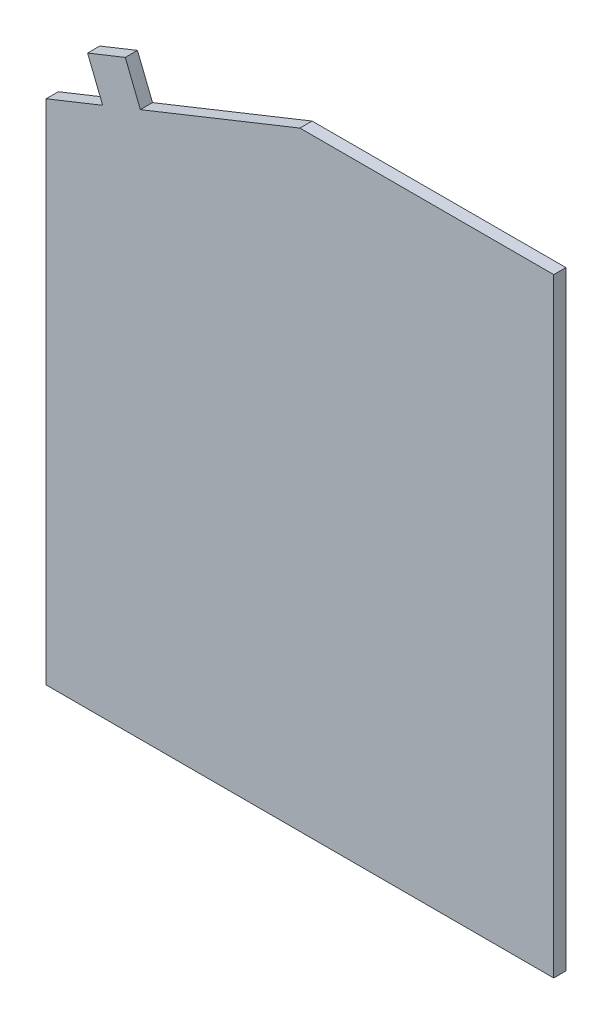
ISO-10303-21;
HEADER;
FILE_DESCRIPTION(('STEP AP214'),'2;1');
FILE_NAME('part.step','',(''),(''),'','','');
FILE_SCHEMA(('AUTOMOTIVE_DESIGN { 1 0 10303 214 1 1 1 1 }'));
ENDSEC;
DATA;
#1=APPLICATION_CONTEXT('core data for automotive mechanical design processes');
#2=APPLICATION_PROTOCOL_DEFINITION('international standard','automotive_design',2000,#1);
#3=PRODUCT_CONTEXT('',#1,'mechanical');
#4=PRODUCT('Part','Part','',(#3));
#5=PRODUCT_RELATED_PRODUCT_CATEGORY('part','',(#4));
#6=PRODUCT_DEFINITION_FORMATION('','',#4);
#7=PRODUCT_DEFINITION_CONTEXT('part definition',#1,'design');
#8=PRODUCT_DEFINITION('design','',#6,#7);
#9=PRODUCT_DEFINITION_SHAPE('','',#8);
#10=(LENGTH_UNIT() NAMED_UNIT(*) SI_UNIT(.MILLI.,.METRE.));
#11=(NAMED_UNIT(*) PLANE_ANGLE_UNIT() SI_UNIT($,.RADIAN.));
#12=(NAMED_UNIT(*) SI_UNIT($,.STERADIAN.) SOLID_ANGLE_UNIT());
#13=UNCERTAINTY_MEASURE_WITH_UNIT(LENGTH_MEASURE(1.E-05),#10,'distance_accuracy_value','');
#14=(GEOMETRIC_REPRESENTATION_CONTEXT(3) GLOBAL_UNCERTAINTY_ASSIGNED_CONTEXT((#13)) GLOBAL_UNIT_ASSIGNED_CONTEXT((#10,
#11,#12)) REPRESENTATION_CONTEXT('',''));
#15=CARTESIAN_POINT('',(0.,0.,0.));
#16=DIRECTION('',(0.,0.,1.));
#17=DIRECTION('',(1.,0.,0.));
#18=AXIS2_PLACEMENT_3D('',#15,#16,#17);
#19=CARTESIAN_POINT('',(0.,0.,3.));
#20=DIRECTION('',(1.,0.,0.));
#21=DIRECTION('',(0.,0.,-1.));
#22=AXIS2_PLACEMENT_3D('',#19,#20,#21);
#23=PLANE('',#22);
#24=DIRECTION('',(0.,-1.,0.));
#25=VECTOR('',#24,1.);
#26=CARTESIAN_POINT('',(0.,0.,0.));
#27=LINE('',#26,#25);
#28=CARTESIAN_POINT('',(0.,125.,0.));
#29=VERTEX_POINT('',#28);
#30=CARTESIAN_POINT('',(0.,0.,0.));
#31=VERTEX_POINT('',#30);
#32=EDGE_CURVE('E139',#29,#31,#27,.T.);
#33=ORIENTED_EDGE('',*,*,#32,.T.);
#34=DIRECTION('',(0.,0.,-1.));
#35=VECTOR('',#34,1.);
#36=CARTESIAN_POINT('',(0.,0.,3.));
#37=LINE('',#36,#35);
#38=CARTESIAN_POINT('',(0.,0.,3.));
#39=VERTEX_POINT('',#38);
#40=EDGE_CURVE('E11',#39,#31,#37,.T.);
#41=ORIENTED_EDGE('',*,*,#40,.F.);
#42=DIRECTION('',(0.,-1.,0.));
#43=VECTOR('',#42,1.);
#44=CARTESIAN_POINT('',(0.,0.,3.));
#45=LINE('',#44,#43);
#46=CARTESIAN_POINT('',(0.,125.,3.));
#47=VERTEX_POINT('',#46);
#48=EDGE_CURVE('E155',#47,#39,#45,.T.);
#49=ORIENTED_EDGE('',*,*,#48,.F.);
#50=DIRECTION('',(0.,0.,-1.));
#51=VECTOR('',#50,1.);
#52=CARTESIAN_POINT('',(0.,125.,3.));
#53=LINE('',#52,#51);
#54=EDGE_CURVE('E135',#47,#29,#53,.T.);
#55=ORIENTED_EDGE('',*,*,#54,.T.);
#56=EDGE_LOOP('',(#33,#41,#49,#55));
#57=FACE_BOUND('',#56,.T.);
#58=ADVANCED_FACE('F37',(#57),#23,.F.);
#59=CARTESIAN_POINT('',(0.,0.,3.));
#60=DIRECTION('',(0.,1.,0.));
#61=DIRECTION('',(0.,0.,1.));
#62=AXIS2_PLACEMENT_3D('',#59,#60,#61);
#63=PLANE('',#62);
#64=DIRECTION('',(1.,0.,0.));
#65=VECTOR('',#64,1.);
#66=CARTESIAN_POINT('',(0.,0.,0.));
#67=LINE('',#66,#65);
#68=CARTESIAN_POINT('',(125.,0.,0.));
#69=VERTEX_POINT('',#68);
#70=EDGE_CURVE('E142',#31,#69,#67,.T.);
#71=ORIENTED_EDGE('',*,*,#70,.T.);
#72=DIRECTION('',(0.,0.,-1.));
#73=VECTOR('',#72,1.);
#74=CARTESIAN_POINT('',(125.,0.,3.));
#75=LINE('',#74,#73);
#76=CARTESIAN_POINT('',(125.,0.,3.));
#77=VERTEX_POINT('',#76);
#78=EDGE_CURVE('E45',#77,#69,#75,.T.);
#79=ORIENTED_EDGE('',*,*,#78,.F.);
#80=DIRECTION('',(1.,0.,0.));
#81=VECTOR('',#80,1.);
#82=CARTESIAN_POINT('',(0.,0.,3.));
#83=LINE('',#82,#81);
#84=EDGE_CURVE('E99',#39,#77,#83,.T.);
#85=ORIENTED_EDGE('',*,*,#84,.F.);
#86=ORIENTED_EDGE('',*,*,#40,.T.);
#87=EDGE_LOOP('',(#71,#79,#85,#86));
#88=FACE_BOUND('',#87,.T.);
#89=ADVANCED_FACE('F198',(#88),#63,.F.);
#90=CARTESIAN_POINT('',(125.,150.,3.));
#91=DIRECTION('',(-1.,0.,0.));
#92=DIRECTION('',(0.,-1.,0.));
#93=AXIS2_PLACEMENT_3D('',#90,#91,#92);
#94=PLANE('',#93);
#95=DIRECTION('',(0.,1.,0.));
#96=VECTOR('',#95,1.);
#97=CARTESIAN_POINT('',(125.,150.,0.));
#98=LINE('',#97,#96);
#99=CARTESIAN_POINT('',(125.,150.,0.));
#100=VERTEX_POINT('',#99);
#101=EDGE_CURVE('E144',#69,#100,#98,.T.);
#102=ORIENTED_EDGE('',*,*,#101,.T.);
#103=DIRECTION('',(0.,0.,-1.));
#104=VECTOR('',#103,1.);
#105=CARTESIAN_POINT('',(125.,150.,3.));
#106=LINE('',#105,#104);
#107=CARTESIAN_POINT('',(125.,150.,3.));
#108=VERTEX_POINT('',#107);
#109=EDGE_CURVE('E165',#108,#100,#106,.T.);
#110=ORIENTED_EDGE('',*,*,#109,.F.);
#111=DIRECTION('',(0.,1.,0.));
#112=VECTOR('',#111,1.);
#113=CARTESIAN_POINT('',(125.,150.,3.));
#114=LINE('',#113,#112);
#115=EDGE_CURVE('E173',#77,#108,#114,.T.);
#116=ORIENTED_EDGE('',*,*,#115,.F.);
#117=ORIENTED_EDGE('',*,*,#78,.T.);
#118=EDGE_LOOP('',(#102,#110,#116,#117));
#119=FACE_BOUND('',#118,.T.);
#120=ADVANCED_FACE('F171',(#119),#94,.F.);
#121=CARTESIAN_POINT('',(125.,150.,3.));
#122=DIRECTION('',(0.,-1.,0.));
#123=DIRECTION('',(0.,0.,-1.));
#124=AXIS2_PLACEMENT_3D('',#121,#122,#123);
#125=PLANE('',#124);
#126=DIRECTION('',(-1.,0.,0.));
#127=VECTOR('',#126,1.);
#128=CARTESIAN_POINT('',(125.,150.,0.));
#129=LINE('',#128,#127);
#130=CARTESIAN_POINT('',(62.5,150.,0.));
#131=VERTEX_POINT('',#130);
#132=EDGE_CURVE('E146',#100,#131,#129,.T.);
#133=ORIENTED_EDGE('',*,*,#132,.T.);
#134=DIRECTION('',(0.,0.,-1.));
#135=VECTOR('',#134,1.);
#136=CARTESIAN_POINT('',(62.5,150.,3.));
#137=LINE('',#136,#135);
#138=CARTESIAN_POINT('',(62.5,150.,3.));
#139=VERTEX_POINT('',#138);
#140=EDGE_CURVE('E162',#139,#131,#137,.T.);
#141=ORIENTED_EDGE('',*,*,#140,.F.);
#142=DIRECTION('',(-1.,0.,0.));
#143=VECTOR('',#142,1.);
#144=CARTESIAN_POINT('',(125.,150.,3.));
#145=LINE('',#144,#143);
#146=EDGE_CURVE('E189',#108,#139,#145,.T.);
#147=ORIENTED_EDGE('',*,*,#146,.F.);
#148=ORIENTED_EDGE('',*,*,#109,.T.);
#149=EDGE_LOOP('',(#133,#141,#147,#148));
#150=FACE_BOUND('',#149,.T.);
#151=ADVANCED_FACE('F182',(#150),#125,.F.);
#152=CARTESIAN_POINT('',(23.2119172721315,134.284766908853,3.));
#153=DIRECTION('',(0.371390676354103,-0.92847669088526,0.));
#154=DIRECTION('',(0.92847669088526,0.371390676354103,0.));
#155=AXIS2_PLACEMENT_3D('',#152,#153,#154);
#156=PLANE('',#155);
#157=DIRECTION('',(-0.928476690885259,-0.371390676354103,0.));
#158=VECTOR('',#157,1.);
#159=CARTESIAN_POINT('',(23.2119172721315,134.284766908853,0.));
#160=LINE('',#159,#158);
#161=CARTESIAN_POINT('',(23.2119172721315,134.284766908853,0.));
#162=VERTEX_POINT('',#161);
#163=EDGE_CURVE('E148',#131,#162,#160,.T.);
#164=ORIENTED_EDGE('',*,*,#163,.T.);
#165=DIRECTION('',(0.,0.,-1.));
#166=VECTOR('',#165,1.);
#167=CARTESIAN_POINT('',(23.2119172721315,134.284766908853,3.));
#168=LINE('',#167,#166);
#169=CARTESIAN_POINT('',(23.2119172721315,134.284766908853,3.));
#170=VERTEX_POINT('',#169);
#171=EDGE_CURVE('E159',#170,#162,#168,.T.);
#172=ORIENTED_EDGE('',*,*,#171,.F.);
#173=DIRECTION('',(-0.928476690885259,-0.371390676354103,0.));
#174=VECTOR('',#173,1.);
#175=CARTESIAN_POINT('',(23.2119172721315,134.284766908853,3.));
#176=LINE('',#175,#174);
#177=EDGE_CURVE('E188',#139,#170,#176,.T.);
#178=ORIENTED_EDGE('',*,*,#177,.F.);
#179=ORIENTED_EDGE('',*,*,#140,.T.);
#180=EDGE_LOOP('',(#164,#172,#178,#179));
#181=FACE_BOUND('',#180,.T.);
#182=ADVANCED_FACE('F186',(#181),#156,.F.);
#183=CARTESIAN_POINT('',(23.2119172721315,134.284766908853,3.));
#184=DIRECTION('',(-0.92847669088526,-0.371390676354102,0.));
#185=DIRECTION('',(0.371390676354102,-0.92847669088526,0.));
#186=AXIS2_PLACEMENT_3D('',#183,#184,#185);
#187=PLANE('',#186);
#188=DIRECTION('',(-0.371390676354102,0.92847669088526,0.));
#189=VECTOR('',#188,1.);
#190=CARTESIAN_POINT('',(23.2119172721315,134.284766908853,0.));
#191=LINE('',#190,#189);
#192=CARTESIAN_POINT('',(19.4980105085904,143.569533817705,0.));
#193=VERTEX_POINT('',#192);
#194=EDGE_CURVE('E150',#162,#193,#191,.T.);
#195=ORIENTED_EDGE('',*,*,#194,.T.);
#196=DIRECTION('',(0.,0.,-1.));
#197=VECTOR('',#196,1.);
#198=CARTESIAN_POINT('',(19.4980105085904,143.569533817705,3.));
#199=LINE('',#198,#197);
#200=CARTESIAN_POINT('',(19.4980105085904,143.569533817705,3.));
#201=VERTEX_POINT('',#200);
#202=EDGE_CURVE('E130',#201,#193,#199,.T.);
#203=ORIENTED_EDGE('',*,*,#202,.F.);
#204=DIRECTION('',(-0.371390676354102,0.92847669088526,0.));
#205=VECTOR('',#204,1.);
#206=CARTESIAN_POINT('',(23.2119172721315,134.284766908853,3.));
#207=LINE('',#206,#205);
#208=EDGE_CURVE('E121',#170,#201,#207,.T.);
#209=ORIENTED_EDGE('',*,*,#208,.F.);
#210=ORIENTED_EDGE('',*,*,#171,.T.);
#211=EDGE_LOOP('',(#195,#203,#209,#210));
#212=FACE_BOUND('',#211,.T.);
#213=ADVANCED_FACE('F210',(#212),#187,.F.);
#214=CARTESIAN_POINT('',(19.4980105085904,143.569533817705,3.));
#215=DIRECTION('',(0.371390676354102,-0.92847669088526,0.));
#216=DIRECTION('',(0.92847669088526,0.371390676354102,0.));
#217=AXIS2_PLACEMENT_3D('',#214,#215,#216);
#218=PLANE('',#217);
#219=DIRECTION('',(-0.92847669088526,-0.371390676354102,0.));
#220=VECTOR('',#219,1.);
#221=CARTESIAN_POINT('',(19.4980105085904,143.569533817705,0.));
#222=LINE('',#221,#220);
#223=CARTESIAN_POINT('',(10.2132435997378,139.855627054164,0.));
#224=VERTEX_POINT('',#223);
#225=EDGE_CURVE('E129',#193,#224,#222,.T.);
#226=ORIENTED_EDGE('',*,*,#225,.T.);
#227=DIRECTION('',(0.,0.,-1.));
#228=VECTOR('',#227,1.);
#229=CARTESIAN_POINT('',(10.2132435997378,139.855627054164,3.));
#230=LINE('',#229,#228);
#231=CARTESIAN_POINT('',(10.2132435997378,139.855627054164,3.));
#232=VERTEX_POINT('',#231);
#233=EDGE_CURVE('E126',#232,#224,#230,.T.);
#234=ORIENTED_EDGE('',*,*,#233,.F.);
#235=DIRECTION('',(-0.92847669088526,-0.371390676354102,0.));
#236=VECTOR('',#235,1.);
#237=CARTESIAN_POINT('',(19.4980105085904,143.569533817705,3.));
#238=LINE('',#237,#236);
#239=EDGE_CURVE('E115',#201,#232,#238,.T.);
#240=ORIENTED_EDGE('',*,*,#239,.F.);
#241=ORIENTED_EDGE('',*,*,#202,.T.);
#242=EDGE_LOOP('',(#226,#234,#240,#241));
#243=FACE_BOUND('',#242,.T.);
#244=ADVANCED_FACE('F127',(#243),#218,.F.);
#245=CARTESIAN_POINT('',(13.9271503632789,130.570860145312,3.));
#246=DIRECTION('',(0.928476690885259,0.371390676354103,0.));
#247=DIRECTION('',(-0.371390676354103,0.928476690885259,0.));
#248=AXIS2_PLACEMENT_3D('',#245,#246,#247);
#249=PLANE('',#248);
#250=DIRECTION('',(0.371390676354103,-0.92847669088526,0.));
#251=VECTOR('',#250,1.);
#252=CARTESIAN_POINT('',(13.9271503632789,130.570860145312,0.));
#253=LINE('',#252,#251);
#254=CARTESIAN_POINT('',(13.9271503632789,130.570860145312,0.));
#255=VERTEX_POINT('',#254);
#256=EDGE_CURVE('E85',#224,#255,#253,.T.);
#257=ORIENTED_EDGE('',*,*,#256,.T.);
#258=DIRECTION('',(0.,0.,-1.));
#259=VECTOR('',#258,1.);
#260=CARTESIAN_POINT('',(13.9271503632789,130.570860145312,3.));
#261=LINE('',#260,#259);
#262=CARTESIAN_POINT('',(13.9271503632789,130.570860145312,3.));
#263=VERTEX_POINT('',#262);
#264=EDGE_CURVE('E131',#263,#255,#261,.T.);
#265=ORIENTED_EDGE('',*,*,#264,.F.);
#266=DIRECTION('',(0.371390676354103,-0.92847669088526,0.));
#267=VECTOR('',#266,1.);
#268=CARTESIAN_POINT('',(13.9271503632789,130.570860145312,3.));
#269=LINE('',#268,#267);
#270=EDGE_CURVE('E119',#232,#263,#269,.T.);
#271=ORIENTED_EDGE('',*,*,#270,.F.);
#272=ORIENTED_EDGE('',*,*,#233,.T.);
#273=EDGE_LOOP('',(#257,#265,#271,#272));
#274=FACE_BOUND('',#273,.T.);
#275=ADVANCED_FACE('F133',(#274),#249,.F.);
#276=CARTESIAN_POINT('',(0.,125.,3.));
#277=DIRECTION('',(0.371390676354104,-0.928476690885259,0.));
#278=DIRECTION('',(0.928476690885259,0.371390676354104,0.));
#279=AXIS2_PLACEMENT_3D('',#276,#277,#278);
#280=PLANE('',#279);
#281=DIRECTION('',(-0.928476690885259,-0.371390676354104,0.));
#282=VECTOR('',#281,1.);
#283=CARTESIAN_POINT('',(0.,125.,0.));
#284=LINE('',#283,#282);
#285=EDGE_CURVE('E91',#255,#29,#284,.T.);
#286=ORIENTED_EDGE('',*,*,#285,.T.);
#287=ORIENTED_EDGE('',*,*,#54,.F.);
#288=DIRECTION('',(-0.928476690885259,-0.371390676354104,0.));
#289=VECTOR('',#288,1.);
#290=CARTESIAN_POINT('',(0.,125.,3.));
#291=LINE('',#290,#289);
#292=EDGE_CURVE('E53',#263,#47,#291,.T.);
#293=ORIENTED_EDGE('',*,*,#292,.F.);
#294=ORIENTED_EDGE('',*,*,#264,.T.);
#295=EDGE_LOOP('',(#286,#287,#293,#294));
#296=FACE_BOUND('',#295,.T.);
#297=ADVANCED_FACE('F218',(#296),#280,.F.);
#298=CARTESIAN_POINT('',(0.,0.,3.));
#299=DIRECTION('',(0.,0.,1.));
#300=DIRECTION('',(1.,0.,0.));
#301=AXIS2_PLACEMENT_3D('',#298,#299,#300);
#302=PLANE('',#301);
#303=ORIENTED_EDGE('',*,*,#48,.T.);
#304=ORIENTED_EDGE('',*,*,#84,.T.);
#305=ORIENTED_EDGE('',*,*,#115,.T.);
#306=ORIENTED_EDGE('',*,*,#146,.T.);
#307=ORIENTED_EDGE('',*,*,#177,.T.);
#308=ORIENTED_EDGE('',*,*,#208,.T.);
#309=ORIENTED_EDGE('',*,*,#239,.T.);
#310=ORIENTED_EDGE('',*,*,#270,.T.);
#311=ORIENTED_EDGE('',*,*,#292,.T.);
#312=EDGE_LOOP('',(#303,#304,#305,#306,#307,#308,#309,#310,#311));
#313=FACE_BOUND('',#312,.T.);
#314=ADVANCED_FACE('F117',(#313),#302,.T.);
#315=CARTESIAN_POINT('',(0.,0.,0.));
#316=DIRECTION('',(0.,0.,1.));
#317=DIRECTION('',(1.,0.,0.));
#318=AXIS2_PLACEMENT_3D('',#315,#316,#317);
#319=PLANE('',#318);
#320=ORIENTED_EDGE('',*,*,#32,.F.);
#321=ORIENTED_EDGE('',*,*,#285,.F.);
#322=ORIENTED_EDGE('',*,*,#256,.F.);
#323=ORIENTED_EDGE('',*,*,#225,.F.);
#324=ORIENTED_EDGE('',*,*,#194,.F.);
#325=ORIENTED_EDGE('',*,*,#163,.F.);
#326=ORIENTED_EDGE('',*,*,#132,.F.);
#327=ORIENTED_EDGE('',*,*,#101,.F.);
#328=ORIENTED_EDGE('',*,*,#70,.F.);
#329=EDGE_LOOP('',(#320,#321,#322,#323,#324,#325,#326,#327,#328));
#330=FACE_BOUND('',#329,.T.);
#331=ADVANCED_FACE('F177',(#330),#319,.F.);
#332=CLOSED_SHELL('',(#58,#89,#120,#151,#182,#213,#244,#275,#297,#314,#331));
#333=MANIFOLD_SOLID_BREP('B2',#332);
#334=ADVANCED_BREP_SHAPE_REPRESENTATION('',(#18,#333),#14);
#335=SHAPE_DEFINITION_REPRESENTATION(#9,#334);
ENDSEC;
END-ISO-10303-21;
